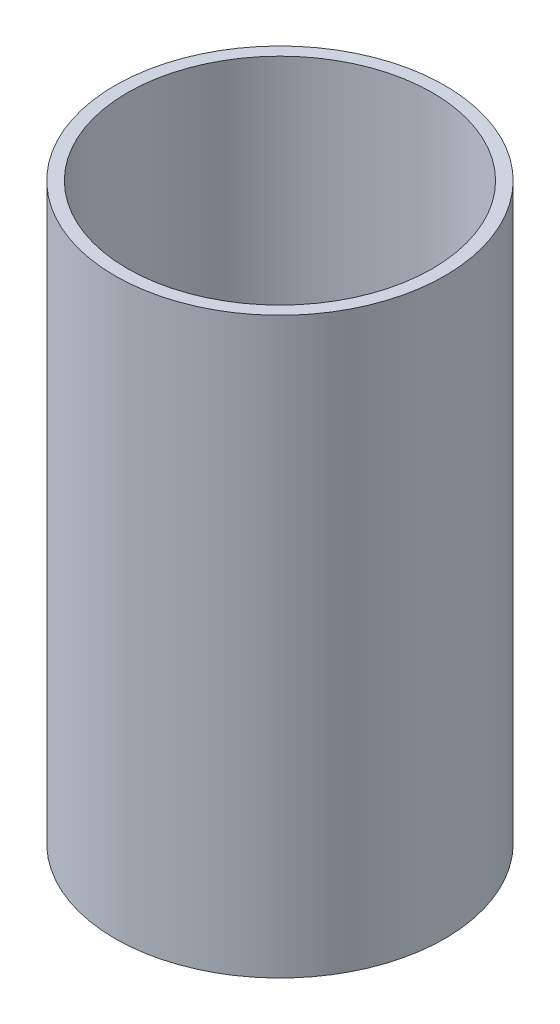
ISO-10303-21;
HEADER;
FILE_DESCRIPTION(('STEP AP214'),'2;1');
FILE_NAME('part.step','',(''),(''),'','','');
FILE_SCHEMA(('AUTOMOTIVE_DESIGN { 1 0 10303 214 1 1 1 1 }'));
ENDSEC;
DATA;
#1=APPLICATION_CONTEXT('core data for automotive mechanical design processes');
#2=APPLICATION_PROTOCOL_DEFINITION('international standard','automotive_design',2000,#1);
#3=PRODUCT_CONTEXT('',#1,'mechanical');
#4=PRODUCT('Part','Part','',(#3));
#5=PRODUCT_RELATED_PRODUCT_CATEGORY('part','',(#4));
#6=PRODUCT_DEFINITION_FORMATION('','',#4);
#7=PRODUCT_DEFINITION_CONTEXT('part definition',#1,'design');
#8=PRODUCT_DEFINITION('design','',#6,#7);
#9=PRODUCT_DEFINITION_SHAPE('','',#8);
#10=(LENGTH_UNIT() NAMED_UNIT(*) SI_UNIT(.MILLI.,.METRE.));
#11=(NAMED_UNIT(*) PLANE_ANGLE_UNIT() SI_UNIT($,.RADIAN.));
#12=(NAMED_UNIT(*) SI_UNIT($,.STERADIAN.) SOLID_ANGLE_UNIT());
#13=UNCERTAINTY_MEASURE_WITH_UNIT(LENGTH_MEASURE(1.E-05),#10,'distance_accuracy_value','');
#14=(GEOMETRIC_REPRESENTATION_CONTEXT(3) GLOBAL_UNCERTAINTY_ASSIGNED_CONTEXT((#13)) GLOBAL_UNIT_ASSIGNED_CONTEXT((#10,
#11,#12)) REPRESENTATION_CONTEXT('',''));
#15=CARTESIAN_POINT('',(0.,0.,0.));
#16=DIRECTION('',(0.,0.,1.));
#17=DIRECTION('',(1.,0.,0.));
#18=AXIS2_PLACEMENT_3D('',#15,#16,#17);
#19=CARTESIAN_POINT('',(0.,115.2,0.));
#20=DIRECTION('',(0.,-1.,0.));
#21=DIRECTION('',(0.,0.,-1.));
#22=AXIS2_PLACEMENT_3D('',#19,#20,#21);
#23=CYLINDRICAL_SURFACE('',#22,30.6);
#24=CARTESIAN_POINT('',(0.,115.2,0.));
#25=DIRECTION('',(0.,1.,0.));
#26=DIRECTION('',(0.,0.,1.));
#27=AXIS2_PLACEMENT_3D('',#24,#25,#26);
#28=CIRCLE('',#27,30.6);
#29=CARTESIAN_POINT('',(0.,115.2,30.6));
#30=VERTEX_POINT('',#29);
#31=EDGE_CURVE('E57',#30,#30,#28,.T.);
#32=ORIENTED_EDGE('',*,*,#31,.T.);
#33=EDGE_LOOP('',(#32));
#34=FACE_BOUND('',#33,.T.);
#35=CARTESIAN_POINT('',(0.,2.5,0.));
#36=DIRECTION('',(0.,1.,0.));
#37=DIRECTION('',(0.,0.,1.));
#38=AXIS2_PLACEMENT_3D('',#35,#36,#37);
#39=CIRCLE('',#38,30.6);
#40=CARTESIAN_POINT('',(0.,2.5,30.6));
#41=VERTEX_POINT('',#40);
#42=EDGE_CURVE('E10',#41,#41,#39,.T.);
#43=ORIENTED_EDGE('',*,*,#42,.F.);
#44=EDGE_LOOP('',(#43));
#45=FACE_BOUND('',#44,.T.);
#46=ADVANCED_FACE('F38',(#34,#45),#23,.F.);
#47=CARTESIAN_POINT('',(0.,2.5,0.));
#48=DIRECTION('',(0.,1.,0.));
#49=DIRECTION('',(0.,0.,1.));
#50=AXIS2_PLACEMENT_3D('',#47,#48,#49);
#51=PLANE('',#50);
#52=ORIENTED_EDGE('',*,*,#42,.T.);
#53=EDGE_LOOP('',(#52));
#54=FACE_BOUND('',#53,.T.);
#55=ADVANCED_FACE('F40',(#54),#51,.T.);
#56=CARTESIAN_POINT('',(0.,115.2,0.));
#57=DIRECTION('',(0.,-1.,0.));
#58=DIRECTION('',(0.,0.,-1.));
#59=AXIS2_PLACEMENT_3D('',#56,#57,#58);
#60=CYLINDRICAL_SURFACE('',#59,33.1);
#61=CARTESIAN_POINT('',(0.,115.2,0.));
#62=DIRECTION('',(0.,1.,0.));
#63=DIRECTION('',(0.,0.,1.));
#64=AXIS2_PLACEMENT_3D('',#61,#62,#63);
#65=CIRCLE('',#64,33.1);
#66=CARTESIAN_POINT('',(0.,115.2,33.1));
#67=VERTEX_POINT('',#66);
#68=EDGE_CURVE('E46',#67,#67,#65,.T.);
#69=ORIENTED_EDGE('',*,*,#68,.F.);
#70=EDGE_LOOP('',(#69));
#71=FACE_BOUND('',#70,.T.);
#72=CARTESIAN_POINT('',(0.,0.,0.));
#73=DIRECTION('',(0.,1.,0.));
#74=DIRECTION('',(0.,0.,1.));
#75=AXIS2_PLACEMENT_3D('',#72,#73,#74);
#76=CIRCLE('',#75,33.1);
#77=CARTESIAN_POINT('',(0.,0.,33.1));
#78=VERTEX_POINT('',#77);
#79=EDGE_CURVE('E51',#78,#78,#76,.T.);
#80=ORIENTED_EDGE('',*,*,#79,.T.);
#81=EDGE_LOOP('',(#80));
#82=FACE_BOUND('',#81,.T.);
#83=ADVANCED_FACE('F68',(#71,#82),#60,.T.);
#84=CARTESIAN_POINT('',(0.,115.2,0.));
#85=DIRECTION('',(0.,1.,0.));
#86=DIRECTION('',(0.,0.,1.));
#87=AXIS2_PLACEMENT_3D('',#84,#85,#86);
#88=PLANE('',#87);
#89=ORIENTED_EDGE('',*,*,#31,.F.);
#90=EDGE_LOOP('',(#89));
#91=FACE_BOUND('',#90,.T.);
#92=ORIENTED_EDGE('',*,*,#68,.T.);
#93=EDGE_LOOP('',(#92));
#94=FACE_BOUND('',#93,.T.);
#95=ADVANCED_FACE('F65',(#91,#94),#88,.T.);
#96=CARTESIAN_POINT('',(0.,0.,0.));
#97=DIRECTION('',(0.,1.,0.));
#98=DIRECTION('',(0.,0.,1.));
#99=AXIS2_PLACEMENT_3D('',#96,#97,#98);
#100=PLANE('',#99);
#101=ORIENTED_EDGE('',*,*,#79,.F.);
#102=EDGE_LOOP('',(#101));
#103=FACE_BOUND('',#102,.T.);
#104=ADVANCED_FACE('F67',(#103),#100,.F.);
#105=CLOSED_SHELL('',(#46,#55,#83,#95,#104));
#106=MANIFOLD_SOLID_BREP('B2',#105);
#107=ADVANCED_BREP_SHAPE_REPRESENTATION('',(#18,#106),#14);
#108=SHAPE_DEFINITION_REPRESENTATION(#9,#107);
ENDSEC;
END-ISO-10303-21;
